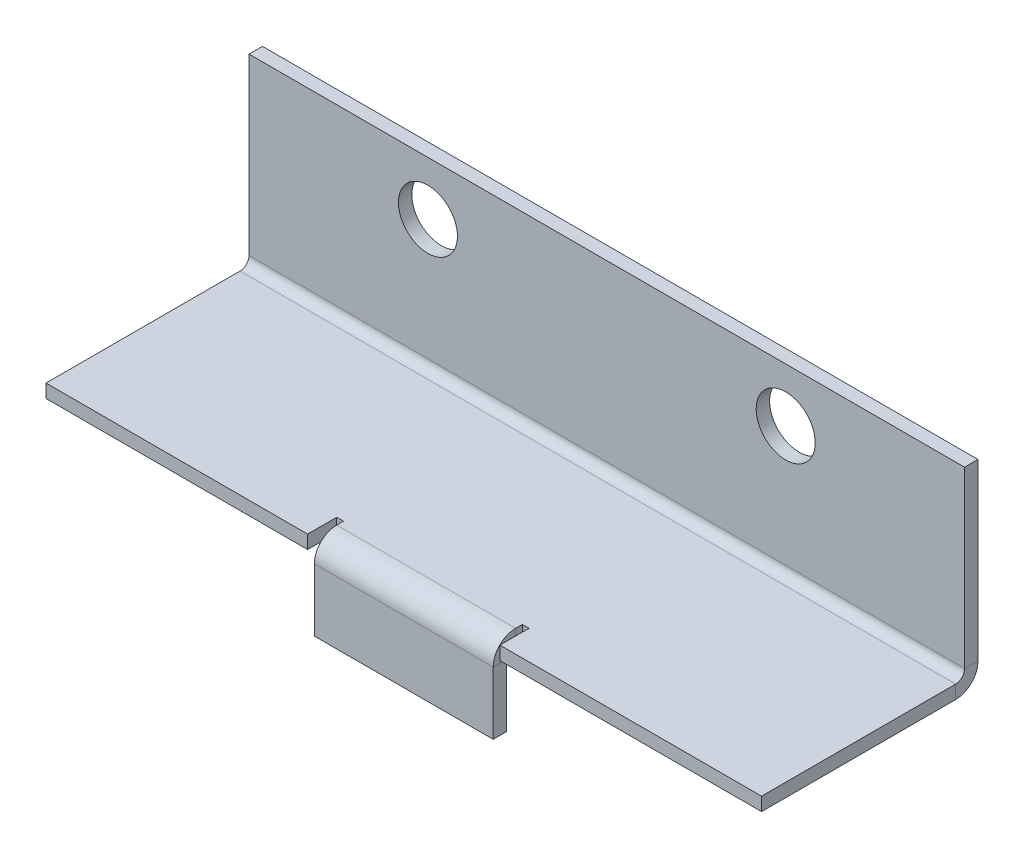
ISO-10303-21;
HEADER;
FILE_DESCRIPTION(('STEP AP214'),'2;1');
FILE_NAME('part.step','',(''),(''),'','','');
FILE_SCHEMA(('AUTOMOTIVE_DESIGN { 1 0 10303 214 1 1 1 1 }'));
ENDSEC;
DATA;
#1=APPLICATION_CONTEXT('core data for automotive mechanical design processes');
#2=APPLICATION_PROTOCOL_DEFINITION('international standard','automotive_design',2000,#1);
#3=PRODUCT_CONTEXT('',#1,'mechanical');
#4=PRODUCT('Part','Part','',(#3));
#5=PRODUCT_RELATED_PRODUCT_CATEGORY('part','',(#4));
#6=PRODUCT_DEFINITION_FORMATION('','',#4);
#7=PRODUCT_DEFINITION_CONTEXT('part definition',#1,'design');
#8=PRODUCT_DEFINITION('design','',#6,#7);
#9=PRODUCT_DEFINITION_SHAPE('','',#8);
#10=(LENGTH_UNIT() NAMED_UNIT(*) SI_UNIT(.MILLI.,.METRE.));
#11=(NAMED_UNIT(*) PLANE_ANGLE_UNIT() SI_UNIT($,.RADIAN.));
#12=(NAMED_UNIT(*) SI_UNIT($,.STERADIAN.) SOLID_ANGLE_UNIT());
#13=UNCERTAINTY_MEASURE_WITH_UNIT(LENGTH_MEASURE(1.E-05),#10,'distance_accuracy_value','');
#14=(GEOMETRIC_REPRESENTATION_CONTEXT(3) GLOBAL_UNCERTAINTY_ASSIGNED_CONTEXT((#13)) GLOBAL_UNIT_ASSIGNED_CONTEXT((#10,
#11,#12)) REPRESENTATION_CONTEXT('',''));
#15=CARTESIAN_POINT('',(0.,0.,0.));
#16=DIRECTION('',(0.,0.,1.));
#17=DIRECTION('',(1.,0.,0.));
#18=AXIS2_PLACEMENT_3D('',#15,#16,#17);
#19=CARTESIAN_POINT('',(40.,-20.5,0.));
#20=DIRECTION('',(0.,-1.,0.));
#21=DIRECTION('',(0.,0.,-1.));
#22=AXIS2_PLACEMENT_3D('',#19,#20,#21);
#23=PLANE('',#22);
#24=DIRECTION('',(0.,0.,1.));
#25=VECTOR('',#24,1.);
#26=CARTESIAN_POINT('',(-10.75,-20.5,0.));
#27=LINE('',#26,#25);
#28=CARTESIAN_POINT('',(-10.75,-20.5,20.95));
#29=VERTEX_POINT('',#28);
#30=CARTESIAN_POINT('',(-10.75,-20.5,24.2));
#31=VERTEX_POINT('',#30);
#32=EDGE_CURVE('E174',#29,#31,#27,.T.);
#33=ORIENTED_EDGE('',*,*,#32,.F.);
#34=DIRECTION('',(-1.,0.,0.));
#35=VECTOR('',#34,1.);
#36=CARTESIAN_POINT('',(40.,-20.5,20.95));
#37=LINE('',#36,#35);
#38=CARTESIAN_POINT('',(-10.,-20.5,20.95));
#39=VERTEX_POINT('',#38);
#40=EDGE_CURVE('E459',#39,#29,#37,.T.);
#41=ORIENTED_EDGE('',*,*,#40,.F.);
#42=DIRECTION('',(0.,0.,-1.));
#43=VECTOR('',#42,1.);
#44=CARTESIAN_POINT('',(-10.,-20.5,0.));
#45=LINE('',#44,#43);
#46=CARTESIAN_POINT('',(-10.,-20.5,21.7));
#47=VERTEX_POINT('',#46);
#48=EDGE_CURVE('E456',#47,#39,#45,.T.);
#49=ORIENTED_EDGE('',*,*,#48,.F.);
#50=DIRECTION('',(-1.,0.,0.));
#51=VECTOR('',#50,1.);
#52=CARTESIAN_POINT('',(-10.,-20.5,21.7));
#53=LINE('',#52,#51);
#54=CARTESIAN_POINT('',(10.,-20.5,21.7));
#55=VERTEX_POINT('',#54);
#56=EDGE_CURVE('E391',#47,#55,#53,.F.);
#57=ORIENTED_EDGE('',*,*,#56,.T.);
#58=DIRECTION('',(0.,0.,1.));
#59=VECTOR('',#58,1.);
#60=CARTESIAN_POINT('',(10.,-20.5,0.));
#61=LINE('',#60,#59);
#62=CARTESIAN_POINT('',(10.,-20.5,20.95));
#63=VERTEX_POINT('',#62);
#64=EDGE_CURVE('E453',#63,#55,#61,.T.);
#65=ORIENTED_EDGE('',*,*,#64,.F.);
#66=DIRECTION('',(-1.,0.,0.));
#67=VECTOR('',#66,1.);
#68=CARTESIAN_POINT('',(40.,-20.5,20.95));
#69=LINE('',#68,#67);
#70=CARTESIAN_POINT('',(10.75,-20.5,20.95));
#71=VERTEX_POINT('',#70);
#72=EDGE_CURVE('E450',#71,#63,#69,.T.);
#73=ORIENTED_EDGE('',*,*,#72,.F.);
#74=DIRECTION('',(0.,0.,-1.));
#75=VECTOR('',#74,1.);
#76=CARTESIAN_POINT('',(10.75,-20.5,0.));
#77=LINE('',#76,#75);
#78=CARTESIAN_POINT('',(10.75,-20.5,24.2));
#79=VERTEX_POINT('',#78);
#80=EDGE_CURVE('E418',#79,#71,#77,.T.);
#81=ORIENTED_EDGE('',*,*,#80,.F.);
#82=DIRECTION('',(-1.,0.,0.));
#83=VECTOR('',#82,1.);
#84=CARTESIAN_POINT('',(40.,-20.5,24.2));
#85=LINE('',#84,#83);
#86=CARTESIAN_POINT('',(40.,-20.5,24.2));
#87=VERTEX_POINT('',#86);
#88=EDGE_CURVE('E205',#87,#79,#85,.T.);
#89=ORIENTED_EDGE('',*,*,#88,.F.);
#90=DIRECTION('',(0.,0.,1.));
#91=VECTOR('',#90,1.);
#92=CARTESIAN_POINT('',(40.,-20.5,0.));
#93=LINE('',#92,#91);
#94=CARTESIAN_POINT('',(40.,-20.5,2.5));
#95=VERTEX_POINT('',#94);
#96=EDGE_CURVE('E119',#95,#87,#93,.T.);
#97=ORIENTED_EDGE('',*,*,#96,.F.);
#98=DIRECTION('',(-1.,0.,0.));
#99=VECTOR('',#98,1.);
#100=CARTESIAN_POINT('',(40.,-20.5,2.5));
#101=LINE('',#100,#99);
#102=CARTESIAN_POINT('',(-40.,-20.5,2.5));
#103=VERTEX_POINT('',#102);
#104=EDGE_CURVE('E169',#95,#103,#101,.T.);
#105=ORIENTED_EDGE('',*,*,#104,.T.);
#106=DIRECTION('',(0.,0.,1.));
#107=VECTOR('',#106,1.);
#108=CARTESIAN_POINT('',(-40.,-20.5,0.));
#109=LINE('',#108,#107);
#110=CARTESIAN_POINT('',(-40.,-20.5,24.2));
#111=VERTEX_POINT('',#110);
#112=EDGE_CURVE('E170',#103,#111,#109,.T.);
#113=ORIENTED_EDGE('',*,*,#112,.T.);
#114=EDGE_CURVE('E204',#31,#111,#85,.T.);
#115=ORIENTED_EDGE('',*,*,#114,.F.);
#116=EDGE_LOOP('',(#33,#41,#49,#57,#65,#73,#81,#89,#97,#105,#113,#115));
#117=FACE_BOUND('',#116,.T.);
#118=ADVANCED_FACE('F57',(#117),#23,.F.);
#119=CARTESIAN_POINT('',(40.,-22.,24.2));
#120=DIRECTION('',(0.,0.,1.));
#121=DIRECTION('',(1.,0.,0.));
#122=AXIS2_PLACEMENT_3D('',#119,#120,#121);
#123=PLANE('',#122);
#124=DIRECTION('',(-1.,0.,0.));
#125=VECTOR('',#124,1.);
#126=CARTESIAN_POINT('',(40.,-22.,24.2));
#127=LINE('',#126,#125);
#128=CARTESIAN_POINT('',(-10.75,-22.,24.2));
#129=VERTEX_POINT('',#128);
#130=CARTESIAN_POINT('',(-40.,-22.,24.2));
#131=VERTEX_POINT('',#130);
#132=EDGE_CURVE('E200',#129,#131,#127,.T.);
#133=ORIENTED_EDGE('',*,*,#132,.F.);
#134=DIRECTION('',(0.,1.,0.));
#135=VECTOR('',#134,1.);
#136=CARTESIAN_POINT('',(-10.75,-22.,24.2));
#137=LINE('',#136,#135);
#138=EDGE_CURVE('E419',#129,#31,#137,.T.);
#139=ORIENTED_EDGE('',*,*,#138,.T.);
#140=ORIENTED_EDGE('',*,*,#114,.T.);
#141=DIRECTION('',(0.,1.,0.));
#142=VECTOR('',#141,1.);
#143=CARTESIAN_POINT('',(-40.,-22.,24.2));
#144=LINE('',#143,#142);
#145=EDGE_CURVE('E173',#131,#111,#144,.T.);
#146=ORIENTED_EDGE('',*,*,#145,.F.);
#147=EDGE_LOOP('',(#133,#139,#140,#146));
#148=FACE_BOUND('',#147,.T.);
#149=ADVANCED_FACE('F237',(#148),#123,.T.);
#150=ORIENTED_EDGE('',*,*,#88,.T.);
#151=DIRECTION('',(0.,1.,0.));
#152=VECTOR('',#151,1.);
#153=CARTESIAN_POINT('',(10.75,-22.,24.2));
#154=LINE('',#153,#152);
#155=CARTESIAN_POINT('',(10.75,-22.,24.2));
#156=VERTEX_POINT('',#155);
#157=EDGE_CURVE('E436',#156,#79,#154,.T.);
#158=ORIENTED_EDGE('',*,*,#157,.F.);
#159=CARTESIAN_POINT('',(40.,-22.,24.2));
#160=VERTEX_POINT('',#159);
#161=EDGE_CURVE('E201',#160,#156,#127,.T.);
#162=ORIENTED_EDGE('',*,*,#161,.F.);
#163=DIRECTION('',(0.,1.,0.));
#164=VECTOR('',#163,1.);
#165=CARTESIAN_POINT('',(40.,-22.,24.2));
#166=LINE('',#165,#164);
#167=EDGE_CURVE('E465',#160,#87,#166,.T.);
#168=ORIENTED_EDGE('',*,*,#167,.T.);
#169=EDGE_LOOP('',(#150,#158,#162,#168));
#170=FACE_BOUND('',#169,.T.);
#171=ADVANCED_FACE('F243',(#170),#123,.T.);
#172=CARTESIAN_POINT('',(40.,-22.,0.));
#173=DIRECTION('',(0.,-1.,0.));
#174=DIRECTION('',(0.,0.,-1.));
#175=AXIS2_PLACEMENT_3D('',#172,#173,#174);
#176=PLANE('',#175);
#177=DIRECTION('',(1.,0.,0.));
#178=VECTOR('',#177,1.);
#179=CARTESIAN_POINT('',(-10.75,-22.,20.95));
#180=LINE('',#179,#178);
#181=CARTESIAN_POINT('',(-10.75,-22.,20.95));
#182=VERTEX_POINT('',#181);
#183=CARTESIAN_POINT('',(-10.,-22.,20.95));
#184=VERTEX_POINT('',#183);
#185=EDGE_CURVE('E420',#182,#184,#180,.T.);
#186=ORIENTED_EDGE('',*,*,#185,.F.);
#187=DIRECTION('',(0.,0.,-1.));
#188=VECTOR('',#187,1.);
#189=CARTESIAN_POINT('',(-10.75,-22.,24.2));
#190=LINE('',#189,#188);
#191=EDGE_CURVE('E415',#129,#182,#190,.T.);
#192=ORIENTED_EDGE('',*,*,#191,.F.);
#193=ORIENTED_EDGE('',*,*,#132,.T.);
#194=DIRECTION('',(0.,0.,1.));
#195=VECTOR('',#194,1.);
#196=CARTESIAN_POINT('',(-40.,-22.,0.));
#197=LINE('',#196,#195);
#198=CARTESIAN_POINT('',(-40.,-22.,2.5));
#199=VERTEX_POINT('',#198);
#200=EDGE_CURVE('E177',#199,#131,#197,.T.);
#201=ORIENTED_EDGE('',*,*,#200,.F.);
#202=DIRECTION('',(-1.,0.,0.));
#203=VECTOR('',#202,1.);
#204=CARTESIAN_POINT('',(40.,-22.,2.5));
#205=LINE('',#204,#203);
#206=CARTESIAN_POINT('',(40.,-22.,2.5));
#207=VERTEX_POINT('',#206);
#208=EDGE_CURVE('E197',#207,#199,#205,.T.);
#209=ORIENTED_EDGE('',*,*,#208,.F.);
#210=DIRECTION('',(0.,0.,1.));
#211=VECTOR('',#210,1.);
#212=CARTESIAN_POINT('',(40.,-22.,0.));
#213=LINE('',#212,#211);
#214=EDGE_CURVE('E220',#207,#160,#213,.T.);
#215=ORIENTED_EDGE('',*,*,#214,.T.);
#216=ORIENTED_EDGE('',*,*,#161,.T.);
#217=DIRECTION('',(0.,0.,1.));
#218=VECTOR('',#217,1.);
#219=CARTESIAN_POINT('',(10.75,-22.,20.95));
#220=LINE('',#219,#218);
#221=CARTESIAN_POINT('',(10.75,-22.,20.95));
#222=VERTEX_POINT('',#221);
#223=EDGE_CURVE('E433',#222,#156,#220,.T.);
#224=ORIENTED_EDGE('',*,*,#223,.F.);
#225=DIRECTION('',(1.,0.,0.));
#226=VECTOR('',#225,1.);
#227=CARTESIAN_POINT('',(10.,-22.,20.95));
#228=LINE('',#227,#226);
#229=CARTESIAN_POINT('',(10.,-22.,20.95));
#230=VERTEX_POINT('',#229);
#231=EDGE_CURVE('E72',#230,#222,#228,.T.);
#232=ORIENTED_EDGE('',*,*,#231,.F.);
#233=DIRECTION('',(0.,0.,-1.));
#234=VECTOR('',#233,1.);
#235=CARTESIAN_POINT('',(10.,-22.,21.7));
#236=LINE('',#235,#234);
#237=CARTESIAN_POINT('',(10.,-22.,21.7));
#238=VERTEX_POINT('',#237);
#239=EDGE_CURVE('E428',#238,#230,#236,.T.);
#240=ORIENTED_EDGE('',*,*,#239,.F.);
#241=DIRECTION('',(-1.,0.,0.));
#242=VECTOR('',#241,1.);
#243=CARTESIAN_POINT('',(-10.,-22.,21.7));
#244=LINE('',#243,#242);
#245=CARTESIAN_POINT('',(-10.,-22.,21.7));
#246=VERTEX_POINT('',#245);
#247=EDGE_CURVE('E404',#246,#238,#244,.F.);
#248=ORIENTED_EDGE('',*,*,#247,.F.);
#249=DIRECTION('',(0.,0.,1.));
#250=VECTOR('',#249,1.);
#251=CARTESIAN_POINT('',(-10.,-22.,20.95));
#252=LINE('',#251,#250);
#253=EDGE_CURVE('E424',#184,#246,#252,.T.);
#254=ORIENTED_EDGE('',*,*,#253,.F.);
#255=EDGE_LOOP('',(#186,#192,#193,#201,#209,#215,#216,#224,#232,#240,#248,#254));
#256=FACE_BOUND('',#255,.T.);
#257=ADVANCED_FACE('F248',(#256),#176,.T.);
#258=CARTESIAN_POINT('',(40.,-22.,2.5));
#259=DIRECTION('',(1.,0.,0.));
#260=DIRECTION('',(0.,0.,-1.));
#261=AXIS2_PLACEMENT_3D('',#258,#259,#260);
#262=PLANE('',#261);
#263=DIRECTION('',(0.,1.,0.));
#264=VECTOR('',#263,1.);
#265=CARTESIAN_POINT('',(40.,-22.,2.5));
#266=LINE('',#265,#264);
#267=EDGE_CURVE('E13',#207,#95,#266,.T.);
#268=ORIENTED_EDGE('',*,*,#267,.F.);
#269=CARTESIAN_POINT('',(40.,-19.5,2.5));
#270=DIRECTION('',(1.,0.,0.));
#271=DIRECTION('',(0.,0.,-1.));
#272=AXIS2_PLACEMENT_3D('',#269,#270,#271);
#273=CIRCLE('',#272,2.5);
#274=CARTESIAN_POINT('',(40.,-19.5,0.));
#275=VERTEX_POINT('',#274);
#276=EDGE_CURVE('E164',#275,#207,#273,.F.);
#277=ORIENTED_EDGE('',*,*,#276,.F.);
#278=DIRECTION('',(0.,0.,-1.));
#279=VECTOR('',#278,1.);
#280=CARTESIAN_POINT('',(40.,-19.5,1.5));
#281=LINE('',#280,#279);
#282=CARTESIAN_POINT('',(40.,-19.5,1.5));
#283=VERTEX_POINT('',#282);
#284=EDGE_CURVE('E65',#283,#275,#281,.T.);
#285=ORIENTED_EDGE('',*,*,#284,.F.);
#286=CARTESIAN_POINT('',(40.,-19.5,2.5));
#287=DIRECTION('',(1.,0.,0.));
#288=DIRECTION('',(0.,0.,-1.));
#289=AXIS2_PLACEMENT_3D('',#286,#287,#288);
#290=CIRCLE('',#289,1.);
#291=EDGE_CURVE('E157',#283,#95,#290,.F.);
#292=ORIENTED_EDGE('',*,*,#291,.T.);
#293=EDGE_LOOP('',(#268,#277,#285,#292));
#294=FACE_BOUND('',#293,.T.);
#295=ADVANCED_FACE('F59',(#294),#262,.T.);
#296=CARTESIAN_POINT('',(40.,-19.5,1.5));
#297=DIRECTION('',(1.,0.,0.));
#298=DIRECTION('',(0.,0.,-1.));
#299=AXIS2_PLACEMENT_3D('',#296,#297,#298);
#300=PLANE('',#299);
#301=ORIENTED_EDGE('',*,*,#214,.F.);
#302=ORIENTED_EDGE('',*,*,#267,.T.);
#303=ORIENTED_EDGE('',*,*,#96,.T.);
#304=ORIENTED_EDGE('',*,*,#167,.F.);
#305=EDGE_LOOP('',(#301,#302,#303,#304));
#306=FACE_BOUND('',#305,.T.);
#307=ADVANCED_FACE('F229',(#306),#300,.T.);
#308=CARTESIAN_POINT('',(-40.,-19.5,0.));
#309=DIRECTION('',(-1.,0.,0.));
#310=DIRECTION('',(0.,0.,1.));
#311=AXIS2_PLACEMENT_3D('',#308,#309,#310);
#312=PLANE('',#311);
#313=DIRECTION('',(0.,0.,1.));
#314=VECTOR('',#313,1.);
#315=CARTESIAN_POINT('',(-40.,-19.5,0.));
#316=LINE('',#315,#314);
#317=CARTESIAN_POINT('',(-40.,-19.5,0.));
#318=VERTEX_POINT('',#317);
#319=CARTESIAN_POINT('',(-40.,-19.5,1.5));
#320=VERTEX_POINT('',#319);
#321=EDGE_CURVE('E209',#318,#320,#316,.T.);
#322=ORIENTED_EDGE('',*,*,#321,.F.);
#323=CARTESIAN_POINT('',(-40.,-19.5,2.5));
#324=DIRECTION('',(1.,0.,0.));
#325=DIRECTION('',(0.,0.,-1.));
#326=AXIS2_PLACEMENT_3D('',#323,#324,#325);
#327=CIRCLE('',#326,2.5);
#328=EDGE_CURVE('E180',#318,#199,#327,.F.);
#329=ORIENTED_EDGE('',*,*,#328,.T.);
#330=DIRECTION('',(0.,-1.,0.));
#331=VECTOR('',#330,1.);
#332=CARTESIAN_POINT('',(-40.,-20.5,2.5));
#333=LINE('',#332,#331);
#334=EDGE_CURVE('E113',#103,#199,#333,.T.);
#335=ORIENTED_EDGE('',*,*,#334,.F.);
#336=CARTESIAN_POINT('',(-40.,-19.5,2.5));
#337=DIRECTION('',(1.,0.,0.));
#338=DIRECTION('',(0.,0.,-1.));
#339=AXIS2_PLACEMENT_3D('',#336,#337,#338);
#340=CIRCLE('',#339,1.);
#341=EDGE_CURVE('E188',#320,#103,#340,.F.);
#342=ORIENTED_EDGE('',*,*,#341,.F.);
#343=EDGE_LOOP('',(#322,#329,#335,#342));
#344=FACE_BOUND('',#343,.T.);
#345=ADVANCED_FACE('F227',(#344),#312,.T.);
#346=CARTESIAN_POINT('',(-40.,-20.5,2.5));
#347=DIRECTION('',(-1.,0.,0.));
#348=DIRECTION('',(0.,0.,1.));
#349=AXIS2_PLACEMENT_3D('',#346,#347,#348);
#350=PLANE('',#349);
#351=DIRECTION('',(0.,-1.,0.));
#352=VECTOR('',#351,1.);
#353=CARTESIAN_POINT('',(-40.,0.,0.));
#354=LINE('',#353,#352);
#355=CARTESIAN_POINT('',(-40.,0.,0.));
#356=VERTEX_POINT('',#355);
#357=EDGE_CURVE('E182',#356,#318,#354,.T.);
#358=ORIENTED_EDGE('',*,*,#357,.T.);
#359=ORIENTED_EDGE('',*,*,#321,.T.);
#360=DIRECTION('',(0.,-1.,0.));
#361=VECTOR('',#360,1.);
#362=CARTESIAN_POINT('',(-40.,0.,1.5));
#363=LINE('',#362,#361);
#364=CARTESIAN_POINT('',(-40.,0.,1.5));
#365=VERTEX_POINT('',#364);
#366=EDGE_CURVE('E186',#365,#320,#363,.T.);
#367=ORIENTED_EDGE('',*,*,#366,.F.);
#368=DIRECTION('',(0.,0.,-1.));
#369=VECTOR('',#368,1.);
#370=CARTESIAN_POINT('',(-40.,0.,1.5));
#371=LINE('',#370,#369);
#372=EDGE_CURVE('E143',#365,#356,#371,.T.);
#373=ORIENTED_EDGE('',*,*,#372,.T.);
#374=EDGE_LOOP('',(#358,#359,#367,#373));
#375=FACE_BOUND('',#374,.T.);
#376=ADVANCED_FACE('F223',(#375),#350,.T.);
#377=CARTESIAN_POINT('',(40.,-19.5,2.5));
#378=DIRECTION('',(-1.,0.,0.));
#379=DIRECTION('',(0.,0.,1.));
#380=AXIS2_PLACEMENT_3D('',#377,#378,#379);
#381=CYLINDRICAL_SURFACE('',#380,2.5);
#382=ORIENTED_EDGE('',*,*,#328,.F.);
#383=DIRECTION('',(-1.,0.,0.));
#384=VECTOR('',#383,1.);
#385=CARTESIAN_POINT('',(40.,-19.5,0.));
#386=LINE('',#385,#384);
#387=EDGE_CURVE('E194',#275,#318,#386,.T.);
#388=ORIENTED_EDGE('',*,*,#387,.F.);
#389=ORIENTED_EDGE('',*,*,#276,.T.);
#390=ORIENTED_EDGE('',*,*,#208,.T.);
#391=EDGE_LOOP('',(#382,#388,#389,#390));
#392=FACE_BOUND('',#391,.T.);
#393=ADVANCED_FACE('F216',(#392),#381,.T.);
#394=CARTESIAN_POINT('',(40.,0.,0.));
#395=DIRECTION('',(0.,0.,-1.));
#396=DIRECTION('',(0.,1.,0.));
#397=AXIS2_PLACEMENT_3D('',#394,#395,#396);
#398=PLANE('',#397);
#399=CARTESIAN_POINT('',(20.,-6.00000000000001,0.));
#400=DIRECTION('',(0.,0.,-1.));
#401=DIRECTION('',(0.,1.,0.));
#402=AXIS2_PLACEMENT_3D('',#399,#400,#401);
#403=CIRCLE('',#402,3.29999999999999);
#404=CARTESIAN_POINT('',(20.,-2.70000000000002,0.));
#405=VERTEX_POINT('',#404);
#406=EDGE_CURVE('E344',#405,#405,#403,.T.);
#407=ORIENTED_EDGE('',*,*,#406,.F.);
#408=EDGE_LOOP('',(#407));
#409=FACE_BOUND('',#408,.T.);
#410=CARTESIAN_POINT('',(-20.,-6.,0.));
#411=DIRECTION('',(0.,0.,-1.));
#412=DIRECTION('',(0.,1.,0.));
#413=AXIS2_PLACEMENT_3D('',#410,#411,#412);
#414=CIRCLE('',#413,3.29999999999999);
#415=CARTESIAN_POINT('',(-20.,-2.70000000000001,0.));
#416=VERTEX_POINT('',#415);
#417=EDGE_CURVE('E346',#416,#416,#414,.T.);
#418=ORIENTED_EDGE('',*,*,#417,.F.);
#419=EDGE_LOOP('',(#418));
#420=FACE_BOUND('',#419,.T.);
#421=ORIENTED_EDGE('',*,*,#357,.F.);
#422=DIRECTION('',(-1.,0.,0.));
#423=VECTOR('',#422,1.);
#424=CARTESIAN_POINT('',(40.,0.,0.));
#425=LINE('',#424,#423);
#426=CARTESIAN_POINT('',(40.,0.,0.));
#427=VERTEX_POINT('',#426);
#428=EDGE_CURVE('E147',#427,#356,#425,.T.);
#429=ORIENTED_EDGE('',*,*,#428,.F.);
#430=DIRECTION('',(0.,-1.,0.));
#431=VECTOR('',#430,1.);
#432=CARTESIAN_POINT('',(40.,0.,0.));
#433=LINE('',#432,#431);
#434=EDGE_CURVE('E162',#427,#275,#433,.T.);
#435=ORIENTED_EDGE('',*,*,#434,.T.);
#436=ORIENTED_EDGE('',*,*,#387,.T.);
#437=EDGE_LOOP('',(#421,#429,#435,#436));
#438=FACE_BOUND('',#437,.T.);
#439=ADVANCED_FACE('F221',(#409,#420,#438),#398,.T.);
#440=CARTESIAN_POINT('',(40.,0.,1.5));
#441=DIRECTION('',(0.,1.,0.));
#442=DIRECTION('',(0.,0.,1.));
#443=AXIS2_PLACEMENT_3D('',#440,#441,#442);
#444=PLANE('',#443);
#445=ORIENTED_EDGE('',*,*,#372,.F.);
#446=DIRECTION('',(-1.,0.,0.));
#447=VECTOR('',#446,1.);
#448=CARTESIAN_POINT('',(40.,0.,1.5));
#449=LINE('',#448,#447);
#450=CARTESIAN_POINT('',(40.,0.,1.5));
#451=VERTEX_POINT('',#450);
#452=EDGE_CURVE('E137',#451,#365,#449,.T.);
#453=ORIENTED_EDGE('',*,*,#452,.F.);
#454=DIRECTION('',(0.,0.,-1.));
#455=VECTOR('',#454,1.);
#456=CARTESIAN_POINT('',(40.,0.,1.5));
#457=LINE('',#456,#455);
#458=EDGE_CURVE('E141',#451,#427,#457,.T.);
#459=ORIENTED_EDGE('',*,*,#458,.T.);
#460=ORIENTED_EDGE('',*,*,#428,.T.);
#461=EDGE_LOOP('',(#445,#453,#459,#460));
#462=FACE_BOUND('',#461,.T.);
#463=ADVANCED_FACE('F139',(#462),#444,.T.);
#464=CARTESIAN_POINT('',(40.,0.,1.5));
#465=DIRECTION('',(0.,0.,-1.));
#466=DIRECTION('',(0.,1.,0.));
#467=AXIS2_PLACEMENT_3D('',#464,#465,#466);
#468=PLANE('',#467);
#469=CARTESIAN_POINT('',(20.,-6.00000000000001,1.5));
#470=DIRECTION('',(0.,0.,-1.));
#471=DIRECTION('',(0.,1.,0.));
#472=AXIS2_PLACEMENT_3D('',#469,#470,#471);
#473=CIRCLE('',#472,3.29999999999999);
#474=CARTESIAN_POINT('',(20.,-2.70000000000001,1.5));
#475=VERTEX_POINT('',#474);
#476=EDGE_CURVE('E341',#475,#475,#473,.T.);
#477=ORIENTED_EDGE('',*,*,#476,.T.);
#478=EDGE_LOOP('',(#477));
#479=FACE_BOUND('',#478,.T.);
#480=CARTESIAN_POINT('',(-20.,-6.,1.5));
#481=DIRECTION('',(0.,0.,-1.));
#482=DIRECTION('',(0.,1.,0.));
#483=AXIS2_PLACEMENT_3D('',#480,#481,#482);
#484=CIRCLE('',#483,3.29999999999999);
#485=CARTESIAN_POINT('',(-20.,-2.70000000000001,1.5));
#486=VERTEX_POINT('',#485);
#487=EDGE_CURVE('E351',#486,#486,#484,.T.);
#488=ORIENTED_EDGE('',*,*,#487,.T.);
#489=EDGE_LOOP('',(#488));
#490=FACE_BOUND('',#489,.T.);
#491=ORIENTED_EDGE('',*,*,#366,.T.);
#492=DIRECTION('',(-1.,0.,0.));
#493=VECTOR('',#492,1.);
#494=CARTESIAN_POINT('',(40.,-19.5,1.5));
#495=LINE('',#494,#493);
#496=EDGE_CURVE('E148',#283,#320,#495,.T.);
#497=ORIENTED_EDGE('',*,*,#496,.F.);
#498=DIRECTION('',(0.,-1.,0.));
#499=VECTOR('',#498,1.);
#500=CARTESIAN_POINT('',(40.,0.,1.5));
#501=LINE('',#500,#499);
#502=EDGE_CURVE('E152',#451,#283,#501,.T.);
#503=ORIENTED_EDGE('',*,*,#502,.F.);
#504=ORIENTED_EDGE('',*,*,#452,.T.);
#505=EDGE_LOOP('',(#491,#497,#503,#504));
#506=FACE_BOUND('',#505,.T.);
#507=ADVANCED_FACE('F153',(#479,#490,#506),#468,.F.);
#508=CARTESIAN_POINT('',(40.,-19.5,2.5));
#509=DIRECTION('',(-1.,0.,0.));
#510=DIRECTION('',(0.,0.,1.));
#511=AXIS2_PLACEMENT_3D('',#508,#509,#510);
#512=CYLINDRICAL_SURFACE('',#511,1.);
#513=ORIENTED_EDGE('',*,*,#341,.T.);
#514=ORIENTED_EDGE('',*,*,#104,.F.);
#515=ORIENTED_EDGE('',*,*,#291,.F.);
#516=ORIENTED_EDGE('',*,*,#496,.T.);
#517=EDGE_LOOP('',(#513,#514,#515,#516));
#518=FACE_BOUND('',#517,.T.);
#519=ADVANCED_FACE('F225',(#518),#512,.F.);
#520=CARTESIAN_POINT('',(40.,-19.5,2.5));
#521=DIRECTION('',(1.,0.,0.));
#522=DIRECTION('',(0.,0.,-1.));
#523=AXIS2_PLACEMENT_3D('',#520,#521,#522);
#524=PLANE('',#523);
#525=ORIENTED_EDGE('',*,*,#502,.T.);
#526=ORIENTED_EDGE('',*,*,#284,.T.);
#527=ORIENTED_EDGE('',*,*,#434,.F.);
#528=ORIENTED_EDGE('',*,*,#458,.F.);
#529=EDGE_LOOP('',(#525,#526,#527,#528));
#530=FACE_BOUND('',#529,.T.);
#531=ADVANCED_FACE('F160',(#530),#524,.T.);
#532=CARTESIAN_POINT('',(-40.,-19.5,2.5));
#533=DIRECTION('',(1.,0.,0.));
#534=DIRECTION('',(0.,0.,-1.));
#535=AXIS2_PLACEMENT_3D('',#532,#533,#534);
#536=PLANE('',#535);
#537=ORIENTED_EDGE('',*,*,#112,.F.);
#538=ORIENTED_EDGE('',*,*,#334,.T.);
#539=ORIENTED_EDGE('',*,*,#200,.T.);
#540=ORIENTED_EDGE('',*,*,#145,.T.);
#541=EDGE_LOOP('',(#537,#538,#539,#540));
#542=FACE_BOUND('',#541,.T.);
#543=ADVANCED_FACE('F264',(#542),#536,.F.);
#544=CARTESIAN_POINT('',(-10.75,-22.,24.2));
#545=DIRECTION('',(1.,0.,0.));
#546=DIRECTION('',(0.,0.,-1.));
#547=AXIS2_PLACEMENT_3D('',#544,#545,#546);
#548=PLANE('',#547);
#549=DIRECTION('',(0.,1.,0.));
#550=VECTOR('',#549,1.);
#551=CARTESIAN_POINT('',(-10.75,-22.,20.95));
#552=LINE('',#551,#550);
#553=EDGE_CURVE('E423',#182,#29,#552,.T.);
#554=ORIENTED_EDGE('',*,*,#553,.T.);
#555=ORIENTED_EDGE('',*,*,#32,.T.);
#556=ORIENTED_EDGE('',*,*,#138,.F.);
#557=ORIENTED_EDGE('',*,*,#191,.T.);
#558=EDGE_LOOP('',(#554,#555,#556,#557));
#559=FACE_BOUND('',#558,.T.);
#560=ADVANCED_FACE('F267',(#559),#548,.T.);
#561=CARTESIAN_POINT('',(-10.75,-22.,20.95));
#562=DIRECTION('',(0.,0.,1.));
#563=DIRECTION('',(0.,-1.,0.));
#564=AXIS2_PLACEMENT_3D('',#561,#562,#563);
#565=PLANE('',#564);
#566=DIRECTION('',(0.,1.,0.));
#567=VECTOR('',#566,1.);
#568=CARTESIAN_POINT('',(-10.,-22.,20.95));
#569=LINE('',#568,#567);
#570=EDGE_CURVE('E427',#184,#39,#569,.T.);
#571=ORIENTED_EDGE('',*,*,#570,.T.);
#572=ORIENTED_EDGE('',*,*,#40,.T.);
#573=ORIENTED_EDGE('',*,*,#553,.F.);
#574=ORIENTED_EDGE('',*,*,#185,.T.);
#575=EDGE_LOOP('',(#571,#572,#573,#574));
#576=FACE_BOUND('',#575,.T.);
#577=ADVANCED_FACE('F273',(#576),#565,.T.);
#578=CARTESIAN_POINT('',(-10.,-22.,20.95));
#579=DIRECTION('',(-1.,0.,0.));
#580=DIRECTION('',(0.,0.,1.));
#581=AXIS2_PLACEMENT_3D('',#578,#579,#580);
#582=PLANE('',#581);
#583=DIRECTION('',(0.,1.,0.));
#584=VECTOR('',#583,1.);
#585=CARTESIAN_POINT('',(-10.,-22.,21.7));
#586=LINE('',#585,#584);
#587=EDGE_CURVE('E398',#246,#47,#586,.T.);
#588=ORIENTED_EDGE('',*,*,#587,.T.);
#589=ORIENTED_EDGE('',*,*,#48,.T.);
#590=ORIENTED_EDGE('',*,*,#570,.F.);
#591=ORIENTED_EDGE('',*,*,#253,.T.);
#592=EDGE_LOOP('',(#588,#589,#590,#591));
#593=FACE_BOUND('',#592,.T.);
#594=ADVANCED_FACE('F277',(#593),#582,.T.);
#595=CARTESIAN_POINT('',(10.,-22.,21.7));
#596=DIRECTION('',(1.,0.,0.));
#597=DIRECTION('',(0.,0.,-1.));
#598=AXIS2_PLACEMENT_3D('',#595,#596,#597);
#599=PLANE('',#598);
#600=DIRECTION('',(0.,1.,0.));
#601=VECTOR('',#600,1.);
#602=CARTESIAN_POINT('',(10.,-22.,20.95));
#603=LINE('',#602,#601);
#604=EDGE_CURVE('E432',#230,#63,#603,.T.);
#605=ORIENTED_EDGE('',*,*,#604,.T.);
#606=ORIENTED_EDGE('',*,*,#64,.T.);
#607=DIRECTION('',(0.,1.,0.));
#608=VECTOR('',#607,1.);
#609=CARTESIAN_POINT('',(10.,-22.,21.7));
#610=LINE('',#609,#608);
#611=EDGE_CURVE('E409',#238,#55,#610,.T.);
#612=ORIENTED_EDGE('',*,*,#611,.F.);
#613=ORIENTED_EDGE('',*,*,#239,.T.);
#614=EDGE_LOOP('',(#605,#606,#612,#613));
#615=FACE_BOUND('',#614,.T.);
#616=ADVANCED_FACE('F281',(#615),#599,.T.);
#617=CARTESIAN_POINT('',(10.,-22.,20.95));
#618=DIRECTION('',(0.,0.,1.));
#619=DIRECTION('',(0.,-1.,0.));
#620=AXIS2_PLACEMENT_3D('',#617,#618,#619);
#621=PLANE('',#620);
#622=DIRECTION('',(0.,1.,0.));
#623=VECTOR('',#622,1.);
#624=CARTESIAN_POINT('',(10.75,-22.,20.95));
#625=LINE('',#624,#623);
#626=EDGE_CURVE('E412',#222,#71,#625,.T.);
#627=ORIENTED_EDGE('',*,*,#626,.T.);
#628=ORIENTED_EDGE('',*,*,#72,.T.);
#629=ORIENTED_EDGE('',*,*,#604,.F.);
#630=ORIENTED_EDGE('',*,*,#231,.T.);
#631=EDGE_LOOP('',(#627,#628,#629,#630));
#632=FACE_BOUND('',#631,.T.);
#633=ADVANCED_FACE('F285',(#632),#621,.T.);
#634=CARTESIAN_POINT('',(10.75,-22.,20.95));
#635=DIRECTION('',(-1.,0.,0.));
#636=DIRECTION('',(0.,0.,1.));
#637=AXIS2_PLACEMENT_3D('',#634,#635,#636);
#638=PLANE('',#637);
#639=ORIENTED_EDGE('',*,*,#157,.T.);
#640=ORIENTED_EDGE('',*,*,#80,.T.);
#641=ORIENTED_EDGE('',*,*,#626,.F.);
#642=ORIENTED_EDGE('',*,*,#223,.T.);
#643=EDGE_LOOP('',(#639,#640,#641,#642));
#644=FACE_BOUND('',#643,.T.);
#645=ADVANCED_FACE('F289',(#644),#638,.T.);
#646=CARTESIAN_POINT('',(10.,-23.,21.7));
#647=DIRECTION('',(1.,0.,0.));
#648=DIRECTION('',(0.,0.,-1.));
#649=AXIS2_PLACEMENT_3D('',#646,#647,#648);
#650=PLANE('',#649);
#651=DIRECTION('',(0.,0.,1.));
#652=VECTOR('',#651,1.);
#653=CARTESIAN_POINT('',(10.,-23.,24.2));
#654=LINE('',#653,#652);
#655=CARTESIAN_POINT('',(10.,-23.,22.7));
#656=VERTEX_POINT('',#655);
#657=CARTESIAN_POINT('',(10.,-23.,24.2));
#658=VERTEX_POINT('',#657);
#659=EDGE_CURVE('E354',#656,#658,#654,.T.);
#660=ORIENTED_EDGE('',*,*,#659,.F.);
#661=CARTESIAN_POINT('',(10.,-23.,21.7));
#662=DIRECTION('',(-1.,0.,0.));
#663=DIRECTION('',(0.,0.,1.));
#664=AXIS2_PLACEMENT_3D('',#661,#662,#663);
#665=CIRCLE('',#664,1.);
#666=EDGE_CURVE('E401',#238,#656,#665,.F.);
#667=ORIENTED_EDGE('',*,*,#666,.F.);
#668=ORIENTED_EDGE('',*,*,#611,.T.);
#669=CARTESIAN_POINT('',(10.,-23.,21.7));
#670=DIRECTION('',(-1.,0.,0.));
#671=DIRECTION('',(0.,0.,1.));
#672=AXIS2_PLACEMENT_3D('',#669,#670,#671);
#673=CIRCLE('',#672,2.5);
#674=EDGE_CURVE('E394',#55,#658,#673,.F.);
#675=ORIENTED_EDGE('',*,*,#674,.T.);
#676=EDGE_LOOP('',(#660,#667,#668,#675));
#677=FACE_BOUND('',#676,.T.);
#678=ADVANCED_FACE('F292',(#677),#650,.T.);
#679=CARTESIAN_POINT('',(-10.,-23.,21.7));
#680=DIRECTION('',(1.,0.,0.));
#681=DIRECTION('',(0.,0.,-1.));
#682=AXIS2_PLACEMENT_3D('',#679,#680,#681);
#683=PLANE('',#682);
#684=CARTESIAN_POINT('',(-10.,-23.,21.7));
#685=DIRECTION('',(-1.,0.,0.));
#686=DIRECTION('',(0.,0.,1.));
#687=AXIS2_PLACEMENT_3D('',#684,#685,#686);
#688=CIRCLE('',#687,1.);
#689=CARTESIAN_POINT('',(-10.,-23.,22.7));
#690=VERTEX_POINT('',#689);
#691=EDGE_CURVE('E358',#690,#246,#688,.T.);
#692=ORIENTED_EDGE('',*,*,#691,.F.);
#693=DIRECTION('',(0.,0.,1.));
#694=VECTOR('',#693,1.);
#695=CARTESIAN_POINT('',(-10.,-23.,22.7));
#696=LINE('',#695,#694);
#697=CARTESIAN_POINT('',(-10.,-23.,24.2));
#698=VERTEX_POINT('',#697);
#699=EDGE_CURVE('E383',#690,#698,#696,.T.);
#700=ORIENTED_EDGE('',*,*,#699,.T.);
#701=CARTESIAN_POINT('',(-10.,-23.,21.7));
#702=DIRECTION('',(-1.,0.,0.));
#703=DIRECTION('',(0.,0.,1.));
#704=AXIS2_PLACEMENT_3D('',#701,#702,#703);
#705=CIRCLE('',#704,2.5);
#706=EDGE_CURVE('E395',#698,#47,#705,.T.);
#707=ORIENTED_EDGE('',*,*,#706,.T.);
#708=ORIENTED_EDGE('',*,*,#587,.F.);
#709=EDGE_LOOP('',(#692,#700,#707,#708));
#710=FACE_BOUND('',#709,.T.);
#711=ADVANCED_FACE('F294',(#710),#683,.F.);
#712=CARTESIAN_POINT('',(-10.,-23.,21.7));
#713=DIRECTION('',(-1.,0.,0.));
#714=DIRECTION('',(0.,0.,1.));
#715=AXIS2_PLACEMENT_3D('',#712,#713,#714);
#716=CYLINDRICAL_SURFACE('',#715,2.5);
#717=ORIENTED_EDGE('',*,*,#56,.F.);
#718=ORIENTED_EDGE('',*,*,#706,.F.);
#719=DIRECTION('',(-1.,0.,0.));
#720=VECTOR('',#719,1.);
#721=CARTESIAN_POINT('',(0.,-23.,24.2));
#722=LINE('',#721,#720);
#723=EDGE_CURVE('E380',#658,#698,#722,.T.);
#724=ORIENTED_EDGE('',*,*,#723,.F.);
#725=ORIENTED_EDGE('',*,*,#674,.F.);
#726=EDGE_LOOP('',(#717,#718,#724,#725));
#727=FACE_BOUND('',#726,.T.);
#728=ADVANCED_FACE('F297',(#727),#716,.T.);
#729=CARTESIAN_POINT('',(-10.,-23.,21.7));
#730=DIRECTION('',(-1.,0.,0.));
#731=DIRECTION('',(0.,0.,1.));
#732=AXIS2_PLACEMENT_3D('',#729,#730,#731);
#733=CYLINDRICAL_SURFACE('',#732,1.);
#734=ORIENTED_EDGE('',*,*,#247,.T.);
#735=ORIENTED_EDGE('',*,*,#666,.T.);
#736=DIRECTION('',(1.,0.,0.));
#737=VECTOR('',#736,1.);
#738=CARTESIAN_POINT('',(10.,-23.,22.7));
#739=LINE('',#738,#737);
#740=EDGE_CURVE('E386',#656,#690,#739,.F.);
#741=ORIENTED_EDGE('',*,*,#740,.T.);
#742=ORIENTED_EDGE('',*,*,#691,.T.);
#743=EDGE_LOOP('',(#734,#735,#741,#742));
#744=FACE_BOUND('',#743,.T.);
#745=ADVANCED_FACE('F302',(#744),#733,.F.);
#746=CARTESIAN_POINT('',(-10.,-22.,24.2));
#747=DIRECTION('',(-1.,0.,0.));
#748=DIRECTION('',(0.,-1.,0.));
#749=AXIS2_PLACEMENT_3D('',#746,#747,#748);
#750=PLANE('',#749);
#751=DIRECTION('',(0.,1.,0.));
#752=VECTOR('',#751,1.);
#753=CARTESIAN_POINT('',(-10.,-22.,24.2));
#754=LINE('',#753,#752);
#755=CARTESIAN_POINT('',(-10.,-30.,24.2));
#756=VERTEX_POINT('',#755);
#757=EDGE_CURVE('E362',#756,#698,#754,.T.);
#758=ORIENTED_EDGE('',*,*,#757,.T.);
#759=ORIENTED_EDGE('',*,*,#699,.F.);
#760=DIRECTION('',(0.,-1.,0.));
#761=VECTOR('',#760,1.);
#762=CARTESIAN_POINT('',(-10.,0.,22.6999999999999));
#763=LINE('',#762,#761);
#764=CARTESIAN_POINT('',(-10.,-30.,22.7));
#765=VERTEX_POINT('',#764);
#766=EDGE_CURVE('E371',#765,#690,#763,.F.);
#767=ORIENTED_EDGE('',*,*,#766,.F.);
#768=DIRECTION('',(0.,0.,-1.));
#769=VECTOR('',#768,1.);
#770=CARTESIAN_POINT('',(-10.,-30.,24.2));
#771=LINE('',#770,#769);
#772=EDGE_CURVE('E355',#756,#765,#771,.T.);
#773=ORIENTED_EDGE('',*,*,#772,.F.);
#774=EDGE_LOOP('',(#758,#759,#767,#773));
#775=FACE_BOUND('',#774,.T.);
#776=ADVANCED_FACE('F305',(#775),#750,.T.);
#777=CARTESIAN_POINT('',(10.,-30.,24.2));
#778=DIRECTION('',(1.,0.,0.));
#779=DIRECTION('',(0.,1.,0.));
#780=AXIS2_PLACEMENT_3D('',#777,#778,#779);
#781=PLANE('',#780);
#782=DIRECTION('',(0.,1.,0.));
#783=VECTOR('',#782,1.);
#784=CARTESIAN_POINT('',(10.,0.,22.6999999999999));
#785=LINE('',#784,#783);
#786=CARTESIAN_POINT('',(10.,-30.,22.7));
#787=VERTEX_POINT('',#786);
#788=EDGE_CURVE('E377',#656,#787,#785,.F.);
#789=ORIENTED_EDGE('',*,*,#788,.F.);
#790=ORIENTED_EDGE('',*,*,#659,.T.);
#791=DIRECTION('',(0.,-1.,0.));
#792=VECTOR('',#791,1.);
#793=CARTESIAN_POINT('',(10.,-30.,24.2));
#794=LINE('',#793,#792);
#795=CARTESIAN_POINT('',(10.,-30.,24.2));
#796=VERTEX_POINT('',#795);
#797=EDGE_CURVE('E368',#658,#796,#794,.T.);
#798=ORIENTED_EDGE('',*,*,#797,.T.);
#799=DIRECTION('',(0.,0.,-1.));
#800=VECTOR('',#799,1.);
#801=CARTESIAN_POINT('',(10.,-30.,24.2));
#802=LINE('',#801,#800);
#803=EDGE_CURVE('E359',#796,#787,#802,.T.);
#804=ORIENTED_EDGE('',*,*,#803,.T.);
#805=EDGE_LOOP('',(#789,#790,#798,#804));
#806=FACE_BOUND('',#805,.T.);
#807=ADVANCED_FACE('F310',(#806),#781,.T.);
#808=CARTESIAN_POINT('',(0.,0.,24.1999999999999));
#809=DIRECTION('',(0.,0.,1.));
#810=DIRECTION('',(0.,-1.,0.));
#811=AXIS2_PLACEMENT_3D('',#808,#809,#810);
#812=PLANE('',#811);
#813=ORIENTED_EDGE('',*,*,#797,.F.);
#814=ORIENTED_EDGE('',*,*,#723,.T.);
#815=ORIENTED_EDGE('',*,*,#757,.F.);
#816=DIRECTION('',(-1.,0.,0.));
#817=VECTOR('',#816,1.);
#818=CARTESIAN_POINT('',(-10.,-30.,24.2));
#819=LINE('',#818,#817);
#820=EDGE_CURVE('E365',#796,#756,#819,.T.);
#821=ORIENTED_EDGE('',*,*,#820,.F.);
#822=EDGE_LOOP('',(#813,#814,#815,#821));
#823=FACE_BOUND('',#822,.T.);
#824=ADVANCED_FACE('F313',(#823),#812,.T.);
#825=CARTESIAN_POINT('',(0.,0.,22.6999999999999));
#826=DIRECTION('',(0.,0.,1.));
#827=DIRECTION('',(0.,-1.,0.));
#828=AXIS2_PLACEMENT_3D('',#825,#826,#827);
#829=PLANE('',#828);
#830=ORIENTED_EDGE('',*,*,#740,.F.);
#831=ORIENTED_EDGE('',*,*,#788,.T.);
#832=DIRECTION('',(1.,0.,0.));
#833=VECTOR('',#832,1.);
#834=CARTESIAN_POINT('',(0.,-30.,22.7));
#835=LINE('',#834,#833);
#836=EDGE_CURVE('E374',#787,#765,#835,.F.);
#837=ORIENTED_EDGE('',*,*,#836,.T.);
#838=ORIENTED_EDGE('',*,*,#766,.T.);
#839=EDGE_LOOP('',(#830,#831,#837,#838));
#840=FACE_BOUND('',#839,.T.);
#841=ADVANCED_FACE('F319',(#840),#829,.F.);
#842=CARTESIAN_POINT('',(-10.,-30.,24.2));
#843=DIRECTION('',(0.,-1.,0.));
#844=DIRECTION('',(0.,0.,-1.));
#845=AXIS2_PLACEMENT_3D('',#842,#843,#844);
#846=PLANE('',#845);
#847=ORIENTED_EDGE('',*,*,#836,.F.);
#848=ORIENTED_EDGE('',*,*,#803,.F.);
#849=ORIENTED_EDGE('',*,*,#820,.T.);
#850=ORIENTED_EDGE('',*,*,#772,.T.);
#851=EDGE_LOOP('',(#847,#848,#849,#850));
#852=FACE_BOUND('',#851,.T.);
#853=ADVANCED_FACE('F315',(#852),#846,.T.);
#854=CARTESIAN_POINT('',(-20.,-6.,0.));
#855=DIRECTION('',(0.,0.,-1.));
#856=DIRECTION('',(0.,1.,0.));
#857=AXIS2_PLACEMENT_3D('',#854,#855,#856);
#858=CYLINDRICAL_SURFACE('',#857,3.29999999999999);
#859=ORIENTED_EDGE('',*,*,#487,.F.);
#860=EDGE_LOOP('',(#859));
#861=FACE_BOUND('',#860,.T.);
#862=ORIENTED_EDGE('',*,*,#417,.T.);
#863=EDGE_LOOP('',(#862));
#864=FACE_BOUND('',#863,.T.);
#865=ADVANCED_FACE('F318',(#861,#864),#858,.F.);
#866=CARTESIAN_POINT('',(20.,-6.00000000000001,0.));
#867=DIRECTION('',(0.,0.,-1.));
#868=DIRECTION('',(0.,1.,0.));
#869=AXIS2_PLACEMENT_3D('',#866,#867,#868);
#870=CYLINDRICAL_SURFACE('',#869,3.29999999999999);
#871=ORIENTED_EDGE('',*,*,#476,.F.);
#872=EDGE_LOOP('',(#871));
#873=FACE_BOUND('',#872,.T.);
#874=ORIENTED_EDGE('',*,*,#406,.T.);
#875=EDGE_LOOP('',(#874));
#876=FACE_BOUND('',#875,.T.);
#877=ADVANCED_FACE('F332',(#873,#876),#870,.F.);
#878=CLOSED_SHELL('',(#118,#149,#171,#257,#295,#307,#345,#376,#393,#439,#463,#507,#519,#531,
#543,#560,#577,#594,#616,#633,#645,#678,#711,#728,#745,#776,#807,#824,#841,#853,#865,#877));
#879=MANIFOLD_SOLID_BREP('B2',#878);
#880=ADVANCED_BREP_SHAPE_REPRESENTATION('',(#18,#879),#14);
#881=SHAPE_DEFINITION_REPRESENTATION(#9,#880);
ENDSEC;
END-ISO-10303-21;
